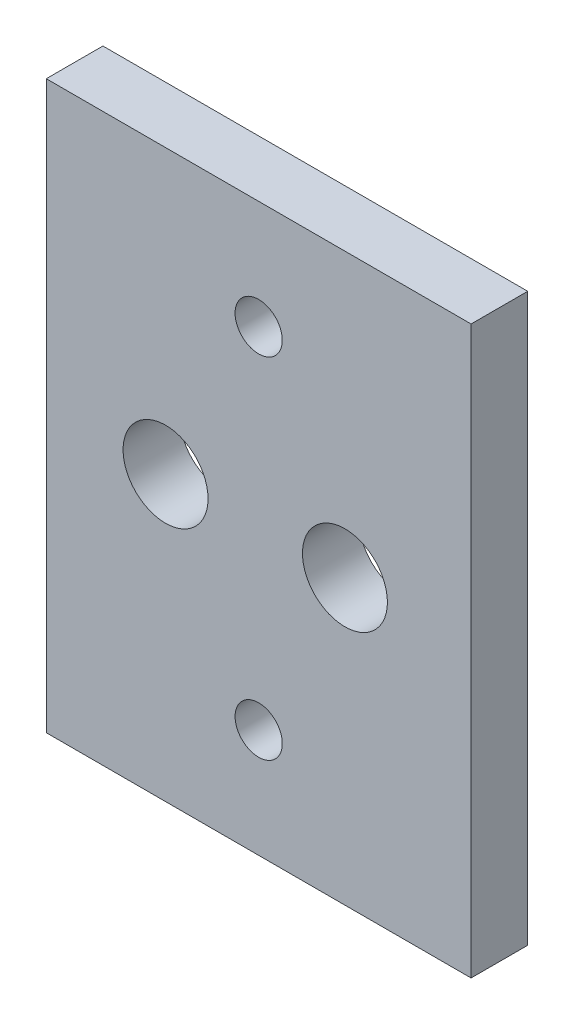
ISO-10303-21;
HEADER;
FILE_DESCRIPTION(('STEP AP214'),'2;1');
FILE_NAME('part.step','',(''),(''),'','','');
FILE_SCHEMA(('AUTOMOTIVE_DESIGN { 1 0 10303 214 1 1 1 1 }'));
ENDSEC;
DATA;
#1=APPLICATION_CONTEXT('core data for automotive mechanical design processes');
#2=APPLICATION_PROTOCOL_DEFINITION('international standard','automotive_design',2000,#1);
#3=PRODUCT_CONTEXT('',#1,'mechanical');
#4=PRODUCT('Part','Part','',(#3));
#5=PRODUCT_RELATED_PRODUCT_CATEGORY('part','',(#4));
#6=PRODUCT_DEFINITION_FORMATION('','',#4);
#7=PRODUCT_DEFINITION_CONTEXT('part definition',#1,'design');
#8=PRODUCT_DEFINITION('design','',#6,#7);
#9=PRODUCT_DEFINITION_SHAPE('','',#8);
#10=(LENGTH_UNIT() NAMED_UNIT(*) SI_UNIT(.MILLI.,.METRE.));
#11=(NAMED_UNIT(*) PLANE_ANGLE_UNIT() SI_UNIT($,.RADIAN.));
#12=(NAMED_UNIT(*) SI_UNIT($,.STERADIAN.) SOLID_ANGLE_UNIT());
#13=UNCERTAINTY_MEASURE_WITH_UNIT(LENGTH_MEASURE(1.E-05),#10,'distance_accuracy_value','');
#14=(GEOMETRIC_REPRESENTATION_CONTEXT(3) GLOBAL_UNCERTAINTY_ASSIGNED_CONTEXT((#13)) GLOBAL_UNIT_ASSIGNED_CONTEXT((#10,
#11,#12)) REPRESENTATION_CONTEXT('',''));
#15=CARTESIAN_POINT('',(0.,0.,0.));
#16=DIRECTION('',(0.,0.,1.));
#17=DIRECTION('',(1.,0.,0.));
#18=AXIS2_PLACEMENT_3D('',#15,#16,#17);
#19=CARTESIAN_POINT('',(-22.5,30.,6.));
#20=DIRECTION('',(0.,1.,0.));
#21=DIRECTION('',(0.,0.,1.));
#22=AXIS2_PLACEMENT_3D('',#19,#20,#21);
#23=PLANE('',#22);
#24=DIRECTION('',(1.,0.,0.));
#25=VECTOR('',#24,1.);
#26=CARTESIAN_POINT('',(-22.5,30.,0.));
#27=LINE('',#26,#25);
#28=CARTESIAN_POINT('',(-22.5,30.,0.));
#29=VERTEX_POINT('',#28);
#30=CARTESIAN_POINT('',(22.5,30.,0.));
#31=VERTEX_POINT('',#30);
#32=EDGE_CURVE('E100',#29,#31,#27,.T.);
#33=ORIENTED_EDGE('',*,*,#32,.F.);
#34=DIRECTION('',(0.,0.,-1.));
#35=VECTOR('',#34,1.);
#36=CARTESIAN_POINT('',(-22.5,30.,6.));
#37=LINE('',#36,#35);
#38=CARTESIAN_POINT('',(-22.5,30.,6.));
#39=VERTEX_POINT('',#38);
#40=EDGE_CURVE('E11',#39,#29,#37,.T.);
#41=ORIENTED_EDGE('',*,*,#40,.F.);
#42=DIRECTION('',(1.,0.,0.));
#43=VECTOR('',#42,1.);
#44=CARTESIAN_POINT('',(-22.5,30.,6.));
#45=LINE('',#44,#43);
#46=CARTESIAN_POINT('',(22.5,30.,6.));
#47=VERTEX_POINT('',#46);
#48=EDGE_CURVE('E93',#39,#47,#45,.T.);
#49=ORIENTED_EDGE('',*,*,#48,.T.);
#50=DIRECTION('',(0.,0.,-1.));
#51=VECTOR('',#50,1.);
#52=CARTESIAN_POINT('',(22.5,30.,6.));
#53=LINE('',#52,#51);
#54=EDGE_CURVE('E38',#47,#31,#53,.T.);
#55=ORIENTED_EDGE('',*,*,#54,.T.);
#56=EDGE_LOOP('',(#33,#41,#49,#55));
#57=FACE_BOUND('',#56,.T.);
#58=ADVANCED_FACE('F35',(#57),#23,.T.);
#59=CARTESIAN_POINT('',(-22.5,-30.,6.));
#60=DIRECTION('',(-1.,0.,0.));
#61=DIRECTION('',(0.,0.,1.));
#62=AXIS2_PLACEMENT_3D('',#59,#60,#61);
#63=PLANE('',#62);
#64=DIRECTION('',(0.,1.,0.));
#65=VECTOR('',#64,1.);
#66=CARTESIAN_POINT('',(-22.5,-30.,0.));
#67=LINE('',#66,#65);
#68=CARTESIAN_POINT('',(-22.5,-30.,0.));
#69=VERTEX_POINT('',#68);
#70=EDGE_CURVE('E95',#69,#29,#67,.T.);
#71=ORIENTED_EDGE('',*,*,#70,.F.);
#72=DIRECTION('',(0.,0.,-1.));
#73=VECTOR('',#72,1.);
#74=CARTESIAN_POINT('',(-22.5,-30.,6.));
#75=LINE('',#74,#73);
#76=CARTESIAN_POINT('',(-22.5,-30.,6.));
#77=VERTEX_POINT('',#76);
#78=EDGE_CURVE('E44',#77,#69,#75,.T.);
#79=ORIENTED_EDGE('',*,*,#78,.F.);
#80=DIRECTION('',(0.,1.,0.));
#81=VECTOR('',#80,1.);
#82=CARTESIAN_POINT('',(-22.5,-30.,6.));
#83=LINE('',#82,#81);
#84=EDGE_CURVE('E90',#77,#39,#83,.T.);
#85=ORIENTED_EDGE('',*,*,#84,.T.);
#86=ORIENTED_EDGE('',*,*,#40,.T.);
#87=EDGE_LOOP('',(#71,#79,#85,#86));
#88=FACE_BOUND('',#87,.T.);
#89=ADVANCED_FACE('F111',(#88),#63,.T.);
#90=CARTESIAN_POINT('',(22.5,-30.,6.));
#91=DIRECTION('',(0.,-1.,0.));
#92=DIRECTION('',(0.,0.,-1.));
#93=AXIS2_PLACEMENT_3D('',#90,#91,#92);
#94=PLANE('',#93);
#95=DIRECTION('',(-1.,0.,0.));
#96=VECTOR('',#95,1.);
#97=CARTESIAN_POINT('',(22.5,-30.,0.));
#98=LINE('',#97,#96);
#99=CARTESIAN_POINT('',(22.5,-30.,0.));
#100=VERTEX_POINT('',#99);
#101=EDGE_CURVE('E85',#100,#69,#98,.T.);
#102=ORIENTED_EDGE('',*,*,#101,.F.);
#103=DIRECTION('',(0.,0.,-1.));
#104=VECTOR('',#103,1.);
#105=CARTESIAN_POINT('',(22.5,-30.,6.));
#106=LINE('',#105,#104);
#107=CARTESIAN_POINT('',(22.5,-30.,6.));
#108=VERTEX_POINT('',#107);
#109=EDGE_CURVE('E80',#108,#100,#106,.T.);
#110=ORIENTED_EDGE('',*,*,#109,.F.);
#111=DIRECTION('',(-1.,0.,0.));
#112=VECTOR('',#111,1.);
#113=CARTESIAN_POINT('',(22.5,-30.,6.));
#114=LINE('',#113,#112);
#115=EDGE_CURVE('E83',#108,#77,#114,.T.);
#116=ORIENTED_EDGE('',*,*,#115,.T.);
#117=ORIENTED_EDGE('',*,*,#78,.T.);
#118=EDGE_LOOP('',(#102,#110,#116,#117));
#119=FACE_BOUND('',#118,.T.);
#120=ADVANCED_FACE('F82',(#119),#94,.T.);
#121=CARTESIAN_POINT('',(22.5,30.,6.));
#122=DIRECTION('',(1.,0.,0.));
#123=DIRECTION('',(0.,0.,-1.));
#124=AXIS2_PLACEMENT_3D('',#121,#122,#123);
#125=PLANE('',#124);
#126=DIRECTION('',(0.,-1.,0.));
#127=VECTOR('',#126,1.);
#128=CARTESIAN_POINT('',(22.5,30.,0.));
#129=LINE('',#128,#127);
#130=EDGE_CURVE('E103',#31,#100,#129,.T.);
#131=ORIENTED_EDGE('',*,*,#130,.F.);
#132=ORIENTED_EDGE('',*,*,#54,.F.);
#133=DIRECTION('',(0.,-1.,0.));
#134=VECTOR('',#133,1.);
#135=CARTESIAN_POINT('',(22.5,30.,6.));
#136=LINE('',#135,#134);
#137=EDGE_CURVE('E89',#47,#108,#136,.T.);
#138=ORIENTED_EDGE('',*,*,#137,.T.);
#139=ORIENTED_EDGE('',*,*,#109,.T.);
#140=EDGE_LOOP('',(#131,#132,#138,#139));
#141=FACE_BOUND('',#140,.T.);
#142=ADVANCED_FACE('F92',(#141),#125,.T.);
#143=CARTESIAN_POINT('',(0.,0.,6.));
#144=DIRECTION('',(0.,0.,-1.));
#145=DIRECTION('',(-1.,0.,0.));
#146=AXIS2_PLACEMENT_3D('',#143,#144,#145);
#147=PLANE('',#146);
#148=CARTESIAN_POINT('',(-9.86286260451722,0.0339940694971883,6.));
#149=DIRECTION('',(0.,0.,-1.));
#150=DIRECTION('',(1.,0.,0.));
#151=AXIS2_PLACEMENT_3D('',#148,#149,#150);
#152=CIRCLE('',#151,4.5);
#153=CARTESIAN_POINT('',(-5.36286260451722,0.0339940694971883,6.));
#154=VERTEX_POINT('',#153);
#155=EDGE_CURVE('E152',#154,#154,#152,.T.);
#156=ORIENTED_EDGE('',*,*,#155,.T.);
#157=EDGE_LOOP('',(#156));
#158=FACE_BOUND('',#157,.T.);
#159=CARTESIAN_POINT('',(0.,-18.5,6.));
#160=DIRECTION('',(0.,0.,-1.));
#161=DIRECTION('',(-1.,0.,0.));
#162=AXIS2_PLACEMENT_3D('',#159,#160,#161);
#163=CIRCLE('',#162,2.5);
#164=CARTESIAN_POINT('',(-2.49999999999999,-18.5,6.));
#165=VERTEX_POINT('',#164);
#166=EDGE_CURVE('E160',#165,#165,#163,.T.);
#167=ORIENTED_EDGE('',*,*,#166,.T.);
#168=EDGE_LOOP('',(#167));
#169=FACE_BOUND('',#168,.T.);
#170=CARTESIAN_POINT('',(0.,18.5,6.));
#171=DIRECTION('',(0.,0.,-1.));
#172=DIRECTION('',(-1.,0.,0.));
#173=AXIS2_PLACEMENT_3D('',#170,#171,#172);
#174=CIRCLE('',#173,2.5);
#175=CARTESIAN_POINT('',(-2.50000000000001,18.5,6.));
#176=VERTEX_POINT('',#175);
#177=EDGE_CURVE('E166',#176,#176,#174,.T.);
#178=ORIENTED_EDGE('',*,*,#177,.T.);
#179=EDGE_LOOP('',(#178));
#180=FACE_BOUND('',#179,.T.);
#181=CARTESIAN_POINT('',(9.13713739548278,0.0339940694971883,6.));
#182=DIRECTION('',(0.,0.,-1.));
#183=DIRECTION('',(1.,0.,0.));
#184=AXIS2_PLACEMENT_3D('',#181,#182,#183);
#185=CIRCLE('',#184,4.5);
#186=CARTESIAN_POINT('',(13.6371373954828,0.0339940694971883,6.));
#187=VERTEX_POINT('',#186);
#188=EDGE_CURVE('E104',#187,#187,#185,.T.);
#189=ORIENTED_EDGE('',*,*,#188,.T.);
#190=EDGE_LOOP('',(#189));
#191=FACE_BOUND('',#190,.T.);
#192=ORIENTED_EDGE('',*,*,#48,.F.);
#193=ORIENTED_EDGE('',*,*,#84,.F.);
#194=ORIENTED_EDGE('',*,*,#115,.F.);
#195=ORIENTED_EDGE('',*,*,#137,.F.);
#196=EDGE_LOOP('',(#192,#193,#194,#195));
#197=FACE_BOUND('',#196,.T.);
#198=ADVANCED_FACE('F88',(#158,#169,#180,#191,#197),#147,.F.);
#199=CARTESIAN_POINT('',(0.,0.,0.));
#200=DIRECTION('',(0.,0.,-1.));
#201=DIRECTION('',(-1.,0.,0.));
#202=AXIS2_PLACEMENT_3D('',#199,#200,#201);
#203=PLANE('',#202);
#204=CARTESIAN_POINT('',(-9.86286260451722,0.0339940694971883,0.));
#205=DIRECTION('',(0.,0.,-1.));
#206=DIRECTION('',(1.,0.,0.));
#207=AXIS2_PLACEMENT_3D('',#204,#205,#206);
#208=CIRCLE('',#207,4.5);
#209=CARTESIAN_POINT('',(-5.36286260451722,0.0339940694971883,0.));
#210=VERTEX_POINT('',#209);
#211=EDGE_CURVE('E155',#210,#210,#208,.T.);
#212=ORIENTED_EDGE('',*,*,#211,.F.);
#213=EDGE_LOOP('',(#212));
#214=FACE_BOUND('',#213,.T.);
#215=CARTESIAN_POINT('',(0.,-18.5,0.));
#216=DIRECTION('',(0.,0.,-1.));
#217=DIRECTION('',(-1.,0.,0.));
#218=AXIS2_PLACEMENT_3D('',#215,#216,#217);
#219=CIRCLE('',#218,2.5);
#220=CARTESIAN_POINT('',(-2.49999999999999,-18.5,0.));
#221=VERTEX_POINT('',#220);
#222=EDGE_CURVE('E157',#221,#221,#219,.T.);
#223=ORIENTED_EDGE('',*,*,#222,.F.);
#224=EDGE_LOOP('',(#223));
#225=FACE_BOUND('',#224,.T.);
#226=CARTESIAN_POINT('',(0.,18.5,0.));
#227=DIRECTION('',(0.,0.,-1.));
#228=DIRECTION('',(-1.,0.,0.));
#229=AXIS2_PLACEMENT_3D('',#226,#227,#228);
#230=CIRCLE('',#229,2.5);
#231=CARTESIAN_POINT('',(-2.50000000000001,18.5,0.));
#232=VERTEX_POINT('',#231);
#233=EDGE_CURVE('E163',#232,#232,#230,.T.);
#234=ORIENTED_EDGE('',*,*,#233,.F.);
#235=EDGE_LOOP('',(#234));
#236=FACE_BOUND('',#235,.T.);
#237=CARTESIAN_POINT('',(9.13713739548278,0.0339940694971883,0.));
#238=DIRECTION('',(0.,0.,-1.));
#239=DIRECTION('',(1.,0.,0.));
#240=AXIS2_PLACEMENT_3D('',#237,#238,#239);
#241=CIRCLE('',#240,4.5);
#242=CARTESIAN_POINT('',(13.6371373954828,0.0339940694971883,0.));
#243=VERTEX_POINT('',#242);
#244=EDGE_CURVE('E169',#243,#243,#241,.T.);
#245=ORIENTED_EDGE('',*,*,#244,.F.);
#246=EDGE_LOOP('',(#245));
#247=FACE_BOUND('',#246,.T.);
#248=ORIENTED_EDGE('',*,*,#32,.T.);
#249=ORIENTED_EDGE('',*,*,#130,.T.);
#250=ORIENTED_EDGE('',*,*,#101,.T.);
#251=ORIENTED_EDGE('',*,*,#70,.T.);
#252=EDGE_LOOP('',(#248,#249,#250,#251));
#253=FACE_BOUND('',#252,.T.);
#254=ADVANCED_FACE('F110',(#214,#225,#236,#247,#253),#203,.T.);
#255=CARTESIAN_POINT('',(9.13713739548278,0.0339940694971883,6.));
#256=DIRECTION('',(0.,0.,-1.));
#257=DIRECTION('',(-1.,0.,0.));
#258=AXIS2_PLACEMENT_3D('',#255,#256,#257);
#259=CYLINDRICAL_SURFACE('',#258,4.5);
#260=ORIENTED_EDGE('',*,*,#188,.F.);
#261=EDGE_LOOP('',(#260));
#262=FACE_BOUND('',#261,.T.);
#263=ORIENTED_EDGE('',*,*,#244,.T.);
#264=EDGE_LOOP('',(#263));
#265=FACE_BOUND('',#264,.T.);
#266=ADVANCED_FACE('F129',(#262,#265),#259,.F.);
#267=CARTESIAN_POINT('',(0.,18.5,6.));
#268=DIRECTION('',(0.,0.,-1.));
#269=DIRECTION('',(-1.,0.,0.));
#270=AXIS2_PLACEMENT_3D('',#267,#268,#269);
#271=CYLINDRICAL_SURFACE('',#270,2.5);
#272=ORIENTED_EDGE('',*,*,#177,.F.);
#273=EDGE_LOOP('',(#272));
#274=FACE_BOUND('',#273,.T.);
#275=ORIENTED_EDGE('',*,*,#233,.T.);
#276=EDGE_LOOP('',(#275));
#277=FACE_BOUND('',#276,.T.);
#278=ADVANCED_FACE('F136',(#274,#277),#271,.F.);
#279=CARTESIAN_POINT('',(0.,-18.5,6.));
#280=DIRECTION('',(0.,0.,-1.));
#281=DIRECTION('',(-1.,0.,0.));
#282=AXIS2_PLACEMENT_3D('',#279,#280,#281);
#283=CYLINDRICAL_SURFACE('',#282,2.5);
#284=ORIENTED_EDGE('',*,*,#166,.F.);
#285=EDGE_LOOP('',(#284));
#286=FACE_BOUND('',#285,.T.);
#287=ORIENTED_EDGE('',*,*,#222,.T.);
#288=EDGE_LOOP('',(#287));
#289=FACE_BOUND('',#288,.T.);
#290=ADVANCED_FACE('F140',(#286,#289),#283,.F.);
#291=CARTESIAN_POINT('',(-9.86286260451722,0.0339940694971883,6.));
#292=DIRECTION('',(0.,0.,-1.));
#293=DIRECTION('',(-1.,0.,0.));
#294=AXIS2_PLACEMENT_3D('',#291,#292,#293);
#295=CYLINDRICAL_SURFACE('',#294,4.5);
#296=ORIENTED_EDGE('',*,*,#155,.F.);
#297=EDGE_LOOP('',(#296));
#298=FACE_BOUND('',#297,.T.);
#299=ORIENTED_EDGE('',*,*,#211,.T.);
#300=EDGE_LOOP('',(#299));
#301=FACE_BOUND('',#300,.T.);
#302=ADVANCED_FACE('F144',(#298,#301),#295,.F.);
#303=CLOSED_SHELL('',(#58,#89,#120,#142,#198,#254,#266,#278,#290,#302));
#304=MANIFOLD_SOLID_BREP('B2',#303);
#305=ADVANCED_BREP_SHAPE_REPRESENTATION('',(#18,#304),#14);
#306=SHAPE_DEFINITION_REPRESENTATION(#9,#305);
ENDSEC;
END-ISO-10303-21;
